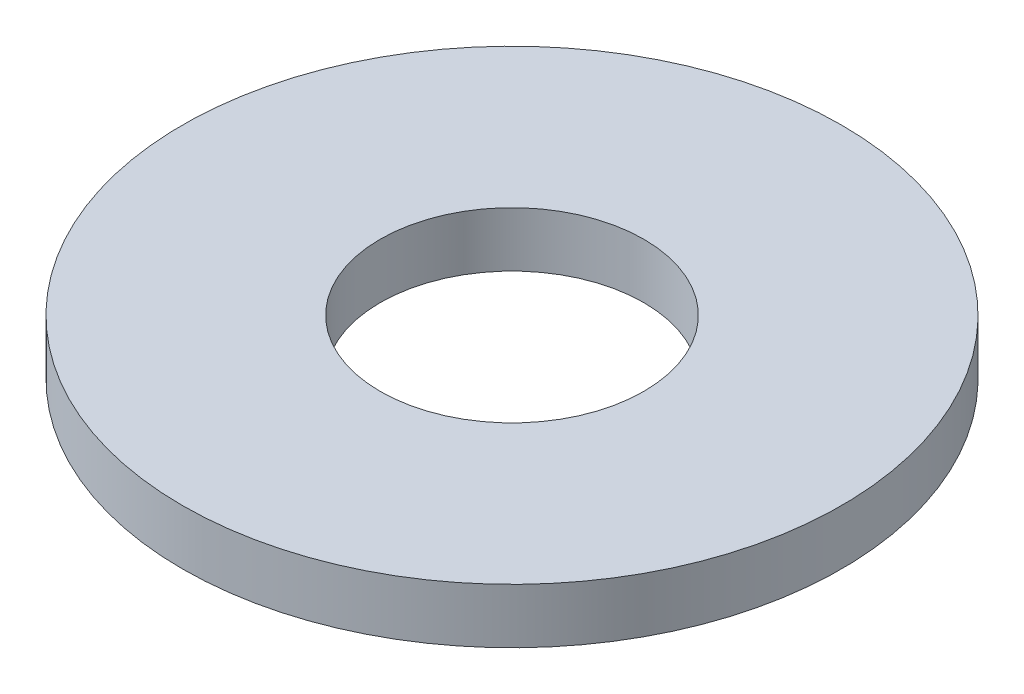
ISO-10303-21;
HEADER;
FILE_DESCRIPTION(('STEP AP214'),'2;1');
FILE_NAME('part.step','',(''),(''),'','','');
FILE_SCHEMA(('AUTOMOTIVE_DESIGN { 1 0 10303 214 1 1 1 1 }'));
ENDSEC;
DATA;
#1=APPLICATION_CONTEXT('core data for automotive mechanical design processes');
#2=APPLICATION_PROTOCOL_DEFINITION('international standard','automotive_design',2000,#1);
#3=PRODUCT_CONTEXT('',#1,'mechanical');
#4=PRODUCT('Part','Part','',(#3));
#5=PRODUCT_RELATED_PRODUCT_CATEGORY('part','',(#4));
#6=PRODUCT_DEFINITION_FORMATION('','',#4);
#7=PRODUCT_DEFINITION_CONTEXT('part definition',#1,'design');
#8=PRODUCT_DEFINITION('design','',#6,#7);
#9=PRODUCT_DEFINITION_SHAPE('','',#8);
#10=(LENGTH_UNIT() NAMED_UNIT(*) SI_UNIT(.MILLI.,.METRE.));
#11=(NAMED_UNIT(*) PLANE_ANGLE_UNIT() SI_UNIT($,.RADIAN.));
#12=(NAMED_UNIT(*) SI_UNIT($,.STERADIAN.) SOLID_ANGLE_UNIT());
#13=UNCERTAINTY_MEASURE_WITH_UNIT(LENGTH_MEASURE(1.E-05),#10,'distance_accuracy_value','');
#14=(GEOMETRIC_REPRESENTATION_CONTEXT(3) GLOBAL_UNCERTAINTY_ASSIGNED_CONTEXT((#13)) GLOBAL_UNIT_ASSIGNED_CONTEXT((#10,
#11,#12)) REPRESENTATION_CONTEXT('',''));
#15=CARTESIAN_POINT('',(0.,0.,0.));
#16=DIRECTION('',(0.,0.,1.));
#17=DIRECTION('',(1.,0.,0.));
#18=AXIS2_PLACEMENT_3D('',#15,#16,#17);
#19=CARTESIAN_POINT('',(0.,2.5,0.));
#20=DIRECTION('',(0.,1.,0.));
#21=DIRECTION('',(0.,0.,1.));
#22=AXIS2_PLACEMENT_3D('',#19,#20,#21);
#23=PLANE('',#22);
#24=CARTESIAN_POINT('',(0.,2.5,0.));
#25=DIRECTION('',(0.,1.,0.));
#26=DIRECTION('',(0.,0.,1.));
#27=AXIS2_PLACEMENT_3D('',#24,#25,#26);
#28=CIRCLE('',#27,15.);
#29=CARTESIAN_POINT('',(0.,2.5,15.));
#30=VERTEX_POINT('',#29);
#31=EDGE_CURVE('E10',#30,#30,#28,.T.);
#32=ORIENTED_EDGE('',*,*,#31,.T.);
#33=EDGE_LOOP('',(#32));
#34=FACE_BOUND('',#33,.T.);
#35=CARTESIAN_POINT('',(0.,2.5,0.));
#36=DIRECTION('',(0.,1.,0.));
#37=DIRECTION('',(0.,0.,1.));
#38=AXIS2_PLACEMENT_3D('',#35,#36,#37);
#39=CIRCLE('',#38,6.);
#40=CARTESIAN_POINT('',(0.,2.5,6.));
#41=VERTEX_POINT('',#40);
#42=EDGE_CURVE('E42',#41,#41,#39,.T.);
#43=ORIENTED_EDGE('',*,*,#42,.F.);
#44=EDGE_LOOP('',(#43));
#45=FACE_BOUND('',#44,.T.);
#46=ADVANCED_FACE('F31',(#34,#45),#23,.T.);
#47=CARTESIAN_POINT('',(0.,0.,0.));
#48=DIRECTION('',(0.,1.,0.));
#49=DIRECTION('',(0.,0.,1.));
#50=AXIS2_PLACEMENT_3D('',#47,#48,#49);
#51=PLANE('',#50);
#52=CARTESIAN_POINT('',(0.,0.,0.));
#53=DIRECTION('',(0.,1.,0.));
#54=DIRECTION('',(0.,0.,1.));
#55=AXIS2_PLACEMENT_3D('',#52,#53,#54);
#56=CIRCLE('',#55,15.);
#57=CARTESIAN_POINT('',(0.,0.,15.));
#58=VERTEX_POINT('',#57);
#59=EDGE_CURVE('E35',#58,#58,#56,.T.);
#60=ORIENTED_EDGE('',*,*,#59,.F.);
#61=EDGE_LOOP('',(#60));
#62=FACE_BOUND('',#61,.T.);
#63=CARTESIAN_POINT('',(0.,0.,0.));
#64=DIRECTION('',(0.,1.,0.));
#65=DIRECTION('',(0.,0.,1.));
#66=AXIS2_PLACEMENT_3D('',#63,#64,#65);
#67=CIRCLE('',#66,6.);
#68=CARTESIAN_POINT('',(0.,0.,6.));
#69=VERTEX_POINT('',#68);
#70=EDGE_CURVE('E44',#69,#69,#67,.T.);
#71=ORIENTED_EDGE('',*,*,#70,.T.);
#72=EDGE_LOOP('',(#71));
#73=FACE_BOUND('',#72,.T.);
#74=ADVANCED_FACE('F54',(#62,#73),#51,.F.);
#75=CARTESIAN_POINT('',(0.,2.5,0.));
#76=DIRECTION('',(0.,-1.,0.));
#77=DIRECTION('',(0.,0.,-1.));
#78=AXIS2_PLACEMENT_3D('',#75,#76,#77);
#79=CYLINDRICAL_SURFACE('',#78,15.);
#80=ORIENTED_EDGE('',*,*,#31,.F.);
#81=EDGE_LOOP('',(#80));
#82=FACE_BOUND('',#81,.T.);
#83=ORIENTED_EDGE('',*,*,#59,.T.);
#84=EDGE_LOOP('',(#83));
#85=FACE_BOUND('',#84,.T.);
#86=ADVANCED_FACE('F33',(#82,#85),#79,.T.);
#87=CARTESIAN_POINT('',(0.,2.5,0.));
#88=DIRECTION('',(0.,-1.,0.));
#89=DIRECTION('',(0.,0.,-1.));
#90=AXIS2_PLACEMENT_3D('',#87,#88,#89);
#91=CYLINDRICAL_SURFACE('',#90,6.);
#92=ORIENTED_EDGE('',*,*,#42,.T.);
#93=EDGE_LOOP('',(#92));
#94=FACE_BOUND('',#93,.T.);
#95=ORIENTED_EDGE('',*,*,#70,.F.);
#96=EDGE_LOOP('',(#95));
#97=FACE_BOUND('',#96,.T.);
#98=ADVANCED_FACE('F50',(#94,#97),#91,.F.);
#99=CLOSED_SHELL('',(#46,#74,#86,#98));
#100=MANIFOLD_SOLID_BREP('B2',#99);
#101=ADVANCED_BREP_SHAPE_REPRESENTATION('',(#18,#100),#14);
#102=SHAPE_DEFINITION_REPRESENTATION(#9,#101);
ENDSEC;
END-ISO-10303-21;
